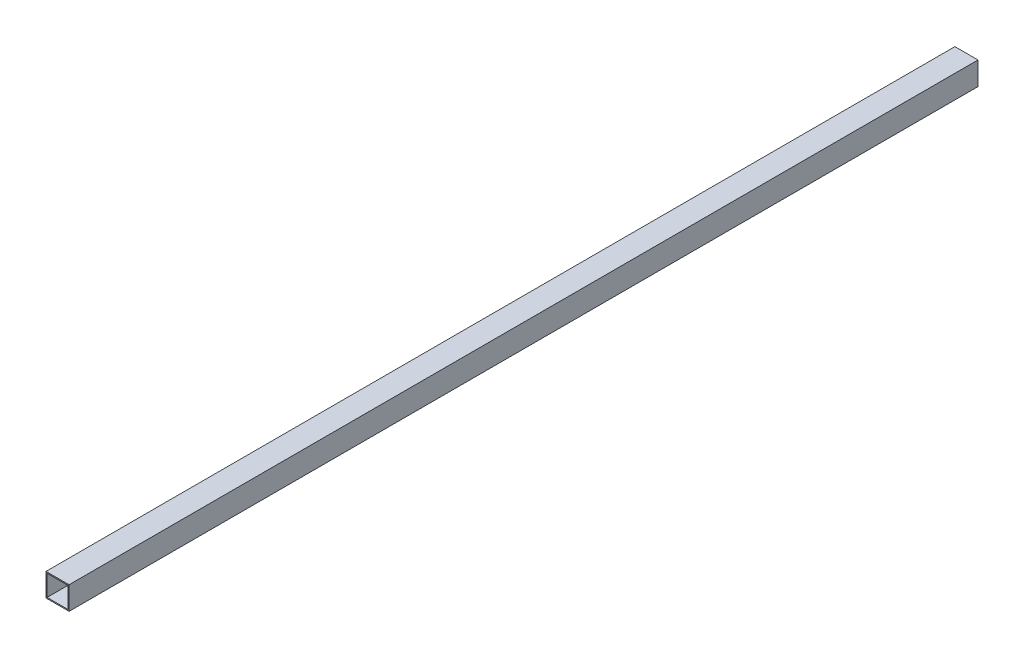
ISO-10303-21;
HEADER;
FILE_DESCRIPTION(('STEP AP214'),'2;1');
FILE_NAME('part.step','',(''),(''),'','','');
FILE_SCHEMA(('AUTOMOTIVE_DESIGN { 1 0 10303 214 1 1 1 1 }'));
ENDSEC;
DATA;
#1=APPLICATION_CONTEXT('core data for automotive mechanical design processes');
#2=APPLICATION_PROTOCOL_DEFINITION('international standard','automotive_design',2000,#1);
#3=PRODUCT_CONTEXT('',#1,'mechanical');
#4=PRODUCT('Part','Part','',(#3));
#5=PRODUCT_RELATED_PRODUCT_CATEGORY('part','',(#4));
#6=PRODUCT_DEFINITION_FORMATION('','',#4);
#7=PRODUCT_DEFINITION_CONTEXT('part definition',#1,'design');
#8=PRODUCT_DEFINITION('design','',#6,#7);
#9=PRODUCT_DEFINITION_SHAPE('','',#8);
#10=(LENGTH_UNIT() NAMED_UNIT(*) SI_UNIT(.MILLI.,.METRE.));
#11=(NAMED_UNIT(*) PLANE_ANGLE_UNIT() SI_UNIT($,.RADIAN.));
#12=(NAMED_UNIT(*) SI_UNIT($,.STERADIAN.) SOLID_ANGLE_UNIT());
#13=UNCERTAINTY_MEASURE_WITH_UNIT(LENGTH_MEASURE(1.E-05),#10,'distance_accuracy_value','');
#14=(GEOMETRIC_REPRESENTATION_CONTEXT(3) GLOBAL_UNCERTAINTY_ASSIGNED_CONTEXT((#13)) GLOBAL_UNIT_ASSIGNED_CONTEXT((#10,
#11,#12)) REPRESENTATION_CONTEXT('',''));
#15=CARTESIAN_POINT('',(0.,0.,0.));
#16=DIRECTION('',(0.,0.,1.));
#17=DIRECTION('',(1.,0.,0.));
#18=AXIS2_PLACEMENT_3D('',#15,#16,#17);
#19=CARTESIAN_POINT('',(0.,0.,500.));
#20=DIRECTION('',(0.,0.,-1.));
#21=DIRECTION('',(-1.,0.,0.));
#22=AXIS2_PLACEMENT_3D('',#19,#20,#21);
#23=PLANE('',#22);
#24=DIRECTION('',(0.,-1.,0.));
#25=VECTOR('',#24,1.);
#26=CARTESIAN_POINT('',(-12.7,12.7,500.));
#27=LINE('',#26,#25);
#28=CARTESIAN_POINT('',(-12.7,12.7,500.));
#29=VERTEX_POINT('',#28);
#30=CARTESIAN_POINT('',(-12.7,-12.7,500.));
#31=VERTEX_POINT('',#30);
#32=EDGE_CURVE('E138',#29,#31,#27,.T.);
#33=ORIENTED_EDGE('',*,*,#32,.T.);
#34=DIRECTION('',(1.,0.,0.));
#35=VECTOR('',#34,1.);
#36=CARTESIAN_POINT('',(12.7,-12.7,500.));
#37=LINE('',#36,#35);
#38=CARTESIAN_POINT('',(12.7,-12.7,500.));
#39=VERTEX_POINT('',#38);
#40=EDGE_CURVE('E141',#31,#39,#37,.T.);
#41=ORIENTED_EDGE('',*,*,#40,.T.);
#42=DIRECTION('',(0.,1.,0.));
#43=VECTOR('',#42,1.);
#44=CARTESIAN_POINT('',(12.7,12.7,500.));
#45=LINE('',#44,#43);
#46=CARTESIAN_POINT('',(12.7,12.7,500.));
#47=VERTEX_POINT('',#46);
#48=EDGE_CURVE('E144',#39,#47,#45,.T.);
#49=ORIENTED_EDGE('',*,*,#48,.T.);
#50=DIRECTION('',(-1.,0.,0.));
#51=VECTOR('',#50,1.);
#52=CARTESIAN_POINT('',(12.7,12.7,500.));
#53=LINE('',#52,#51);
#54=EDGE_CURVE('E146',#47,#29,#53,.T.);
#55=ORIENTED_EDGE('',*,*,#54,.T.);
#56=EDGE_LOOP('',(#33,#41,#49,#55));
#57=FACE_BOUND('',#56,.T.);
#58=DIRECTION('',(-1.,0.,0.));
#59=VECTOR('',#58,1.);
#60=CARTESIAN_POINT('',(11.5,11.5,500.));
#61=LINE('',#60,#59);
#62=CARTESIAN_POINT('',(11.5,11.5,500.));
#63=VERTEX_POINT('',#62);
#64=CARTESIAN_POINT('',(-11.5,11.5,500.));
#65=VERTEX_POINT('',#64);
#66=EDGE_CURVE('E102',#63,#65,#61,.T.);
#67=ORIENTED_EDGE('',*,*,#66,.F.);
#68=DIRECTION('',(0.,1.,0.));
#69=VECTOR('',#68,1.);
#70=CARTESIAN_POINT('',(11.5,11.5,500.));
#71=LINE('',#70,#69);
#72=CARTESIAN_POINT('',(11.5,-11.5,500.));
#73=VERTEX_POINT('',#72);
#74=EDGE_CURVE('E124',#73,#63,#71,.T.);
#75=ORIENTED_EDGE('',*,*,#74,.F.);
#76=DIRECTION('',(1.,0.,0.));
#77=VECTOR('',#76,1.);
#78=CARTESIAN_POINT('',(11.5,-11.5,500.));
#79=LINE('',#78,#77);
#80=CARTESIAN_POINT('',(-11.5,-11.5,500.));
#81=VERTEX_POINT('',#80);
#82=EDGE_CURVE('E122',#81,#73,#79,.T.);
#83=ORIENTED_EDGE('',*,*,#82,.F.);
#84=DIRECTION('',(0.,-1.,0.));
#85=VECTOR('',#84,1.);
#86=CARTESIAN_POINT('',(-11.5,11.5,500.));
#87=LINE('',#86,#85);
#88=EDGE_CURVE('E110',#65,#81,#87,.T.);
#89=ORIENTED_EDGE('',*,*,#88,.F.);
#90=EDGE_LOOP('',(#67,#75,#83,#89));
#91=FACE_BOUND('',#90,.T.);
#92=ADVANCED_FACE('F37',(#57,#91),#23,.F.);
#93=CARTESIAN_POINT('',(0.,0.,-500.));
#94=DIRECTION('',(0.,0.,-1.));
#95=DIRECTION('',(-1.,0.,0.));
#96=AXIS2_PLACEMENT_3D('',#93,#94,#95);
#97=PLANE('',#96);
#98=DIRECTION('',(0.,-1.,0.));
#99=VECTOR('',#98,1.);
#100=CARTESIAN_POINT('',(-12.7,12.7,-500.));
#101=LINE('',#100,#99);
#102=CARTESIAN_POINT('',(-12.7,12.7,-500.));
#103=VERTEX_POINT('',#102);
#104=CARTESIAN_POINT('',(-12.7,-12.7,-500.));
#105=VERTEX_POINT('',#104);
#106=EDGE_CURVE('E118',#103,#105,#101,.T.);
#107=ORIENTED_EDGE('',*,*,#106,.F.);
#108=DIRECTION('',(-1.,0.,0.));
#109=VECTOR('',#108,1.);
#110=CARTESIAN_POINT('',(12.7,12.7,-500.));
#111=LINE('',#110,#109);
#112=CARTESIAN_POINT('',(12.7,12.7,-500.));
#113=VERTEX_POINT('',#112);
#114=EDGE_CURVE('E142',#113,#103,#111,.T.);
#115=ORIENTED_EDGE('',*,*,#114,.F.);
#116=DIRECTION('',(0.,1.,0.));
#117=VECTOR('',#116,1.);
#118=CARTESIAN_POINT('',(12.7,12.7,-500.));
#119=LINE('',#118,#117);
#120=CARTESIAN_POINT('',(12.7,-12.7,-500.));
#121=VERTEX_POINT('',#120);
#122=EDGE_CURVE('E153',#121,#113,#119,.T.);
#123=ORIENTED_EDGE('',*,*,#122,.F.);
#124=DIRECTION('',(1.,0.,0.));
#125=VECTOR('',#124,1.);
#126=CARTESIAN_POINT('',(12.7,-12.7,-500.));
#127=LINE('',#126,#125);
#128=EDGE_CURVE('E151',#105,#121,#127,.T.);
#129=ORIENTED_EDGE('',*,*,#128,.F.);
#130=EDGE_LOOP('',(#107,#115,#123,#129));
#131=FACE_BOUND('',#130,.T.);
#132=DIRECTION('',(0.,1.,0.));
#133=VECTOR('',#132,1.);
#134=CARTESIAN_POINT('',(11.5,11.5,-500.));
#135=LINE('',#134,#133);
#136=CARTESIAN_POINT('',(11.5,-11.5,-500.));
#137=VERTEX_POINT('',#136);
#138=CARTESIAN_POINT('',(11.5,11.5,-500.));
#139=VERTEX_POINT('',#138);
#140=EDGE_CURVE('E111',#137,#139,#135,.T.);
#141=ORIENTED_EDGE('',*,*,#140,.T.);
#142=DIRECTION('',(-1.,0.,0.));
#143=VECTOR('',#142,1.);
#144=CARTESIAN_POINT('',(11.5,11.5,-500.));
#145=LINE('',#144,#143);
#146=CARTESIAN_POINT('',(-11.5,11.5,-500.));
#147=VERTEX_POINT('',#146);
#148=EDGE_CURVE('E60',#139,#147,#145,.T.);
#149=ORIENTED_EDGE('',*,*,#148,.T.);
#150=DIRECTION('',(0.,-1.,0.));
#151=VECTOR('',#150,1.);
#152=CARTESIAN_POINT('',(-11.5,11.5,-500.));
#153=LINE('',#152,#151);
#154=CARTESIAN_POINT('',(-11.5,-11.5,-500.));
#155=VERTEX_POINT('',#154);
#156=EDGE_CURVE('E117',#147,#155,#153,.T.);
#157=ORIENTED_EDGE('',*,*,#156,.T.);
#158=DIRECTION('',(1.,0.,0.));
#159=VECTOR('',#158,1.);
#160=CARTESIAN_POINT('',(11.5,-11.5,-500.));
#161=LINE('',#160,#159);
#162=EDGE_CURVE('E130',#155,#137,#161,.T.);
#163=ORIENTED_EDGE('',*,*,#162,.T.);
#164=EDGE_LOOP('',(#141,#149,#157,#163));
#165=FACE_BOUND('',#164,.T.);
#166=ADVANCED_FACE('F171',(#131,#165),#97,.T.);
#167=CARTESIAN_POINT('',(-12.7,12.7,500.));
#168=DIRECTION('',(1.,0.,0.));
#169=DIRECTION('',(0.,1.,0.));
#170=AXIS2_PLACEMENT_3D('',#167,#168,#169);
#171=PLANE('',#170);
#172=ORIENTED_EDGE('',*,*,#106,.T.);
#173=DIRECTION('',(0.,0.,-1.));
#174=VECTOR('',#173,1.);
#175=CARTESIAN_POINT('',(-12.7,-12.7,500.));
#176=LINE('',#175,#174);
#177=EDGE_CURVE('E11',#31,#105,#176,.T.);
#178=ORIENTED_EDGE('',*,*,#177,.F.);
#179=ORIENTED_EDGE('',*,*,#32,.F.);
#180=DIRECTION('',(0.,0.,-1.));
#181=VECTOR('',#180,1.);
#182=CARTESIAN_POINT('',(-12.7,12.7,500.));
#183=LINE('',#182,#181);
#184=EDGE_CURVE('E148',#29,#103,#183,.T.);
#185=ORIENTED_EDGE('',*,*,#184,.T.);
#186=EDGE_LOOP('',(#172,#178,#179,#185));
#187=FACE_BOUND('',#186,.T.);
#188=ADVANCED_FACE('F39',(#187),#171,.F.);
#189=CARTESIAN_POINT('',(12.7,-12.7,500.));
#190=DIRECTION('',(0.,1.,0.));
#191=DIRECTION('',(-1.,0.,0.));
#192=AXIS2_PLACEMENT_3D('',#189,#190,#191);
#193=PLANE('',#192);
#194=ORIENTED_EDGE('',*,*,#128,.T.);
#195=DIRECTION('',(0.,0.,-1.));
#196=VECTOR('',#195,1.);
#197=CARTESIAN_POINT('',(12.7,-12.7,500.));
#198=LINE('',#197,#196);
#199=EDGE_CURVE('E45',#39,#121,#198,.T.);
#200=ORIENTED_EDGE('',*,*,#199,.F.);
#201=ORIENTED_EDGE('',*,*,#40,.F.);
#202=ORIENTED_EDGE('',*,*,#177,.T.);
#203=EDGE_LOOP('',(#194,#200,#201,#202));
#204=FACE_BOUND('',#203,.T.);
#205=ADVANCED_FACE('F181',(#204),#193,.F.);
#206=CARTESIAN_POINT('',(12.7,12.7,500.));
#207=DIRECTION('',(-1.,0.,0.));
#208=DIRECTION('',(0.,-1.,0.));
#209=AXIS2_PLACEMENT_3D('',#206,#207,#208);
#210=PLANE('',#209);
#211=ORIENTED_EDGE('',*,*,#122,.T.);
#212=DIRECTION('',(0.,0.,-1.));
#213=VECTOR('',#212,1.);
#214=CARTESIAN_POINT('',(12.7,12.7,500.));
#215=LINE('',#214,#213);
#216=EDGE_CURVE('E158',#47,#113,#215,.T.);
#217=ORIENTED_EDGE('',*,*,#216,.F.);
#218=ORIENTED_EDGE('',*,*,#48,.F.);
#219=ORIENTED_EDGE('',*,*,#199,.T.);
#220=EDGE_LOOP('',(#211,#217,#218,#219));
#221=FACE_BOUND('',#220,.T.);
#222=ADVANCED_FACE('F165',(#221),#210,.F.);
#223=CARTESIAN_POINT('',(12.7,12.7,500.));
#224=DIRECTION('',(0.,-1.,0.));
#225=DIRECTION('',(1.,0.,0.));
#226=AXIS2_PLACEMENT_3D('',#223,#224,#225);
#227=PLANE('',#226);
#228=ORIENTED_EDGE('',*,*,#114,.T.);
#229=ORIENTED_EDGE('',*,*,#184,.F.);
#230=ORIENTED_EDGE('',*,*,#54,.F.);
#231=ORIENTED_EDGE('',*,*,#216,.T.);
#232=EDGE_LOOP('',(#228,#229,#230,#231));
#233=FACE_BOUND('',#232,.T.);
#234=ADVANCED_FACE('F175',(#233),#227,.F.);
#235=CARTESIAN_POINT('',(11.5,11.5,500.));
#236=DIRECTION('',(0.,-1.,0.));
#237=DIRECTION('',(0.,0.,-1.));
#238=AXIS2_PLACEMENT_3D('',#235,#236,#237);
#239=PLANE('',#238);
#240=ORIENTED_EDGE('',*,*,#148,.F.);
#241=DIRECTION('',(0.,0.,-1.));
#242=VECTOR('',#241,1.);
#243=CARTESIAN_POINT('',(11.5,11.5,500.));
#244=LINE('',#243,#242);
#245=EDGE_CURVE('E106',#63,#139,#244,.T.);
#246=ORIENTED_EDGE('',*,*,#245,.F.);
#247=ORIENTED_EDGE('',*,*,#66,.T.);
#248=DIRECTION('',(0.,0.,-1.));
#249=VECTOR('',#248,1.);
#250=CARTESIAN_POINT('',(-11.5,11.5,500.));
#251=LINE('',#250,#249);
#252=EDGE_CURVE('E105',#65,#147,#251,.T.);
#253=ORIENTED_EDGE('',*,*,#252,.T.);
#254=EDGE_LOOP('',(#240,#246,#247,#253));
#255=FACE_BOUND('',#254,.T.);
#256=ADVANCED_FACE('F104',(#255),#239,.T.);
#257=CARTESIAN_POINT('',(-11.5,11.5,500.));
#258=DIRECTION('',(1.,0.,0.));
#259=DIRECTION('',(0.,0.,-1.));
#260=AXIS2_PLACEMENT_3D('',#257,#258,#259);
#261=PLANE('',#260);
#262=ORIENTED_EDGE('',*,*,#156,.F.);
#263=ORIENTED_EDGE('',*,*,#252,.F.);
#264=ORIENTED_EDGE('',*,*,#88,.T.);
#265=DIRECTION('',(0.,0.,-1.));
#266=VECTOR('',#265,1.);
#267=CARTESIAN_POINT('',(-11.5,-11.5,500.));
#268=LINE('',#267,#266);
#269=EDGE_CURVE('E119',#81,#155,#268,.T.);
#270=ORIENTED_EDGE('',*,*,#269,.T.);
#271=EDGE_LOOP('',(#262,#263,#264,#270));
#272=FACE_BOUND('',#271,.T.);
#273=ADVANCED_FACE('F114',(#272),#261,.T.);
#274=CARTESIAN_POINT('',(11.5,-11.5,500.));
#275=DIRECTION('',(0.,1.,0.));
#276=DIRECTION('',(0.,0.,1.));
#277=AXIS2_PLACEMENT_3D('',#274,#275,#276);
#278=PLANE('',#277);
#279=ORIENTED_EDGE('',*,*,#162,.F.);
#280=ORIENTED_EDGE('',*,*,#269,.F.);
#281=ORIENTED_EDGE('',*,*,#82,.T.);
#282=DIRECTION('',(0.,0.,-1.));
#283=VECTOR('',#282,1.);
#284=CARTESIAN_POINT('',(11.5,-11.5,500.));
#285=LINE('',#284,#283);
#286=EDGE_CURVE('E52',#73,#137,#285,.T.);
#287=ORIENTED_EDGE('',*,*,#286,.T.);
#288=EDGE_LOOP('',(#279,#280,#281,#287));
#289=FACE_BOUND('',#288,.T.);
#290=ADVANCED_FACE('F204',(#289),#278,.T.);
#291=CARTESIAN_POINT('',(11.5,11.5,500.));
#292=DIRECTION('',(-1.,0.,0.));
#293=DIRECTION('',(0.,0.,1.));
#294=AXIS2_PLACEMENT_3D('',#291,#292,#293);
#295=PLANE('',#294);
#296=ORIENTED_EDGE('',*,*,#140,.F.);
#297=ORIENTED_EDGE('',*,*,#286,.F.);
#298=ORIENTED_EDGE('',*,*,#74,.T.);
#299=ORIENTED_EDGE('',*,*,#245,.T.);
#300=EDGE_LOOP('',(#296,#297,#298,#299));
#301=FACE_BOUND('',#300,.T.);
#302=ADVANCED_FACE('F208',(#301),#295,.T.);
#303=CLOSED_SHELL('',(#92,#166,#188,#205,#222,#234,#256,#273,#290,#302));
#304=MANIFOLD_SOLID_BREP('B2',#303);
#305=ADVANCED_BREP_SHAPE_REPRESENTATION('',(#18,#304),#14);
#306=SHAPE_DEFINITION_REPRESENTATION(#9,#305);
ENDSEC;
END-ISO-10303-21;
